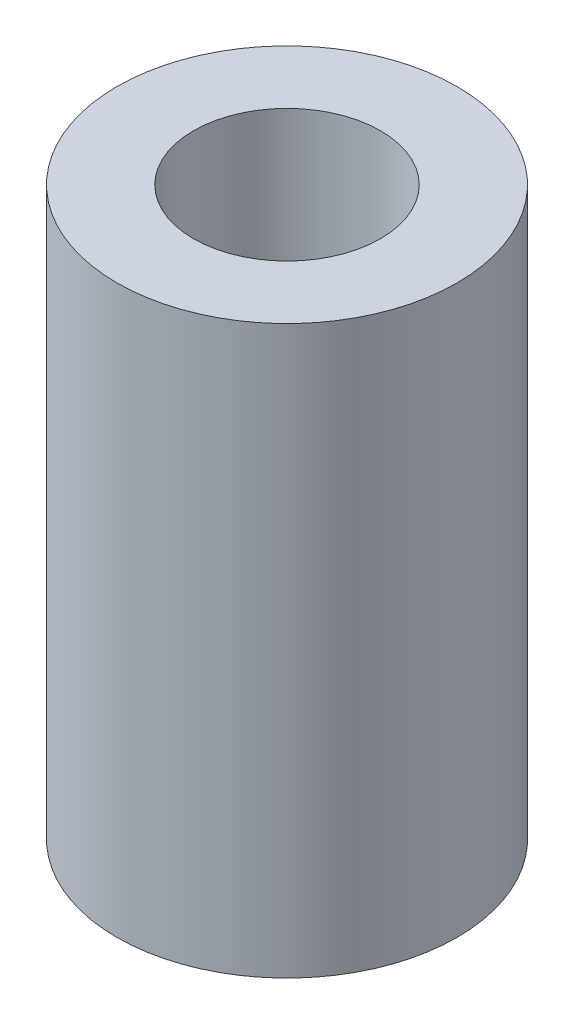
ISO-10303-21;
HEADER;
FILE_DESCRIPTION(('STEP AP214'),'2;1');
FILE_NAME('part.step','',(''),(''),'','','');
FILE_SCHEMA(('AUTOMOTIVE_DESIGN { 1 0 10303 214 1 1 1 1 }'));
ENDSEC;
DATA;
#1=APPLICATION_CONTEXT('core data for automotive mechanical design processes');
#2=APPLICATION_PROTOCOL_DEFINITION('international standard','automotive_design',2000,#1);
#3=PRODUCT_CONTEXT('',#1,'mechanical');
#4=PRODUCT('Part','Part','',(#3));
#5=PRODUCT_RELATED_PRODUCT_CATEGORY('part','',(#4));
#6=PRODUCT_DEFINITION_FORMATION('','',#4);
#7=PRODUCT_DEFINITION_CONTEXT('part definition',#1,'design');
#8=PRODUCT_DEFINITION('design','',#6,#7);
#9=PRODUCT_DEFINITION_SHAPE('','',#8);
#10=(LENGTH_UNIT() NAMED_UNIT(*) SI_UNIT(.MILLI.,.METRE.));
#11=(NAMED_UNIT(*) PLANE_ANGLE_UNIT() SI_UNIT($,.RADIAN.));
#12=(NAMED_UNIT(*) SI_UNIT($,.STERADIAN.) SOLID_ANGLE_UNIT());
#13=UNCERTAINTY_MEASURE_WITH_UNIT(LENGTH_MEASURE(1.E-05),#10,'distance_accuracy_value','');
#14=(GEOMETRIC_REPRESENTATION_CONTEXT(3) GLOBAL_UNCERTAINTY_ASSIGNED_CONTEXT((#13)) GLOBAL_UNIT_ASSIGNED_CONTEXT((#10,
#11,#12)) REPRESENTATION_CONTEXT('',''));
#15=CARTESIAN_POINT('',(0.,0.,0.));
#16=DIRECTION('',(0.,0.,1.));
#17=DIRECTION('',(1.,0.,0.));
#18=AXIS2_PLACEMENT_3D('',#15,#16,#17);
#19=CARTESIAN_POINT('',(0.,10.,0.));
#20=DIRECTION('',(0.,-1.,0.));
#21=DIRECTION('',(0.,0.,-1.));
#22=AXIS2_PLACEMENT_3D('',#19,#20,#21);
#23=CYLINDRICAL_SURFACE('',#22,3.);
#24=CARTESIAN_POINT('',(0.,10.,0.));
#25=DIRECTION('',(0.,1.,0.));
#26=DIRECTION('',(0.,0.,1.));
#27=AXIS2_PLACEMENT_3D('',#24,#25,#26);
#28=CIRCLE('',#27,3.);
#29=CARTESIAN_POINT('',(0.,10.,3.));
#30=VERTEX_POINT('',#29);
#31=EDGE_CURVE('E10',#30,#30,#28,.T.);
#32=ORIENTED_EDGE('',*,*,#31,.F.);
#33=EDGE_LOOP('',(#32));
#34=FACE_BOUND('',#33,.T.);
#35=CARTESIAN_POINT('',(0.,0.,0.));
#36=DIRECTION('',(0.,1.,0.));
#37=DIRECTION('',(0.,0.,1.));
#38=AXIS2_PLACEMENT_3D('',#35,#36,#37);
#39=CIRCLE('',#38,3.);
#40=CARTESIAN_POINT('',(0.,0.,3.));
#41=VERTEX_POINT('',#40);
#42=EDGE_CURVE('E37',#41,#41,#39,.T.);
#43=ORIENTED_EDGE('',*,*,#42,.T.);
#44=EDGE_LOOP('',(#43));
#45=FACE_BOUND('',#44,.T.);
#46=ADVANCED_FACE('F34',(#34,#45),#23,.T.);
#47=CARTESIAN_POINT('',(0.,10.,0.));
#48=DIRECTION('',(0.,1.,0.));
#49=DIRECTION('',(0.,0.,1.));
#50=AXIS2_PLACEMENT_3D('',#47,#48,#49);
#51=PLANE('',#50);
#52=CARTESIAN_POINT('',(0.,10.,0.));
#53=DIRECTION('',(0.,1.,0.));
#54=DIRECTION('',(0.,0.,1.));
#55=AXIS2_PLACEMENT_3D('',#52,#53,#54);
#56=CIRCLE('',#55,1.65);
#57=CARTESIAN_POINT('',(0.,10.,1.65));
#58=VERTEX_POINT('',#57);
#59=EDGE_CURVE('E48',#58,#58,#56,.T.);
#60=ORIENTED_EDGE('',*,*,#59,.F.);
#61=EDGE_LOOP('',(#60));
#62=FACE_BOUND('',#61,.T.);
#63=ORIENTED_EDGE('',*,*,#31,.T.);
#64=EDGE_LOOP('',(#63));
#65=FACE_BOUND('',#64,.T.);
#66=ADVANCED_FACE('F54',(#62,#65),#51,.T.);
#67=CARTESIAN_POINT('',(0.,0.,0.));
#68=DIRECTION('',(0.,1.,0.));
#69=DIRECTION('',(0.,0.,1.));
#70=AXIS2_PLACEMENT_3D('',#67,#68,#69);
#71=PLANE('',#70);
#72=CARTESIAN_POINT('',(0.,0.,0.));
#73=DIRECTION('',(0.,1.,0.));
#74=DIRECTION('',(0.,0.,1.));
#75=AXIS2_PLACEMENT_3D('',#72,#73,#74);
#76=CIRCLE('',#75,1.65);
#77=CARTESIAN_POINT('',(0.,0.,1.65));
#78=VERTEX_POINT('',#77);
#79=EDGE_CURVE('E44',#78,#78,#76,.T.);
#80=ORIENTED_EDGE('',*,*,#79,.T.);
#81=EDGE_LOOP('',(#80));
#82=FACE_BOUND('',#81,.T.);
#83=ORIENTED_EDGE('',*,*,#42,.F.);
#84=EDGE_LOOP('',(#83));
#85=FACE_BOUND('',#84,.T.);
#86=ADVANCED_FACE('F56',(#82,#85),#71,.F.);
#87=CARTESIAN_POINT('',(0.,10.,0.));
#88=DIRECTION('',(0.,1.,0.));
#89=DIRECTION('',(0.,0.,1.));
#90=AXIS2_PLACEMENT_3D('',#87,#88,#89);
#91=CYLINDRICAL_SURFACE('',#90,1.65);
#92=ORIENTED_EDGE('',*,*,#79,.F.);
#93=EDGE_LOOP('',(#92));
#94=FACE_BOUND('',#93,.T.);
#95=ORIENTED_EDGE('',*,*,#59,.T.);
#96=EDGE_LOOP('',(#95));
#97=FACE_BOUND('',#96,.T.);
#98=ADVANCED_FACE('F52',(#94,#97),#91,.F.);
#99=CLOSED_SHELL('',(#46,#66,#86,#98));
#100=MANIFOLD_SOLID_BREP('B2',#99);
#101=ADVANCED_BREP_SHAPE_REPRESENTATION('',(#18,#100),#14);
#102=SHAPE_DEFINITION_REPRESENTATION(#9,#101);
ENDSEC;
END-ISO-10303-21;
